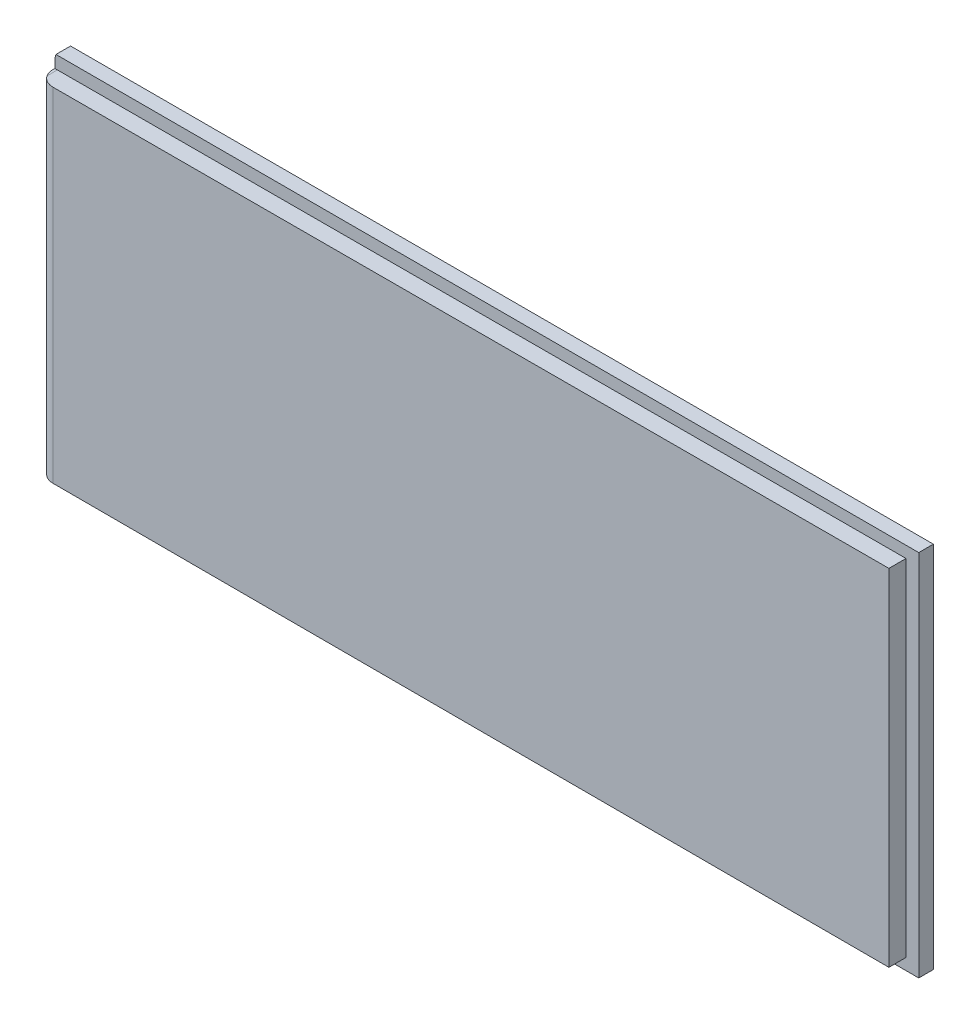
ISO-10303-21;
HEADER;
FILE_DESCRIPTION(('STEP AP214'),'2;1');
FILE_NAME('part.step','',(''),(''),'','','');
FILE_SCHEMA(('AUTOMOTIVE_DESIGN { 1 0 10303 214 1 1 1 1 }'));
ENDSEC;
DATA;
#1=APPLICATION_CONTEXT('core data for automotive mechanical design processes');
#2=APPLICATION_PROTOCOL_DEFINITION('international standard','automotive_design',2000,#1);
#3=PRODUCT_CONTEXT('',#1,'mechanical');
#4=PRODUCT('Part','Part','',(#3));
#5=PRODUCT_RELATED_PRODUCT_CATEGORY('part','',(#4));
#6=PRODUCT_DEFINITION_FORMATION('','',#4);
#7=PRODUCT_DEFINITION_CONTEXT('part definition',#1,'design');
#8=PRODUCT_DEFINITION('design','',#6,#7);
#9=PRODUCT_DEFINITION_SHAPE('','',#8);
#10=(LENGTH_UNIT() NAMED_UNIT(*) SI_UNIT(.MILLI.,.METRE.));
#11=(NAMED_UNIT(*) PLANE_ANGLE_UNIT() SI_UNIT($,.RADIAN.));
#12=(NAMED_UNIT(*) SI_UNIT($,.STERADIAN.) SOLID_ANGLE_UNIT());
#13=UNCERTAINTY_MEASURE_WITH_UNIT(LENGTH_MEASURE(1.E-05),#10,'distance_accuracy_value','');
#14=(GEOMETRIC_REPRESENTATION_CONTEXT(3) GLOBAL_UNCERTAINTY_ASSIGNED_CONTEXT((#13)) GLOBAL_UNIT_ASSIGNED_CONTEXT((#10,
#11,#12)) REPRESENTATION_CONTEXT('',''));
#15=CARTESIAN_POINT('',(0.,0.,0.));
#16=DIRECTION('',(0.,0.,1.));
#17=DIRECTION('',(1.,0.,0.));
#18=AXIS2_PLACEMENT_3D('',#15,#16,#17);
#19=CARTESIAN_POINT('',(-89.5000000000007,-14.,1.85342345181059));
#20=DIRECTION('',(0.,0.,1.));
#21=DIRECTION('',(1.,0.,0.));
#22=AXIS2_PLACEMENT_3D('',#19,#20,#21);
#23=PLANE('',#22);
#24=DIRECTION('',(0.999998918686875,0.00147058664512815,0.));
#25=VECTOR('',#24,1.);
#26=CARTESIAN_POINT('',(-24.0000000000007,13.5992641652252,1.8534234518106));
#27=LINE('',#26,#25);
#28=CARTESIAN_POINT('',(-89.8000000000006,13.5024994593429,1.8534234518106));
#29=VERTEX_POINT('',#28);
#30=CARTESIAN_POINT('',(-24.0000000000007,13.5992641652252,1.8534234518106));
#31=VERTEX_POINT('',#30);
#32=EDGE_CURVE('E136',#29,#31,#27,.T.);
#33=ORIENTED_EDGE('',*,*,#32,.F.);
#34=DIRECTION('',(0.,-1.,0.));
#35=VECTOR('',#34,1.);
#36=CARTESIAN_POINT('',(-89.8000000000007,-14.,1.85342345181059));
#37=LINE('',#36,#35);
#38=CARTESIAN_POINT('',(-89.8000000000007,-13.5024994593428,1.8534234518106));
#39=VERTEX_POINT('',#38);
#40=EDGE_CURVE('E252',#29,#39,#37,.T.);
#41=ORIENTED_EDGE('',*,*,#40,.T.);
#42=DIRECTION('',(-0.999998918686875,0.00147058664512737,0.));
#43=VECTOR('',#42,1.);
#44=CARTESIAN_POINT('',(-90.8000000000007,-13.5010288711075,1.8534234518106));
#45=LINE('',#44,#43);
#46=CARTESIAN_POINT('',(-24.0000000000007,-13.5992641652252,1.8534234518106));
#47=VERTEX_POINT('',#46);
#48=EDGE_CURVE('E161',#47,#39,#45,.T.);
#49=ORIENTED_EDGE('',*,*,#48,.F.);
#50=DIRECTION('',(0.,-1.,0.));
#51=VECTOR('',#50,1.);
#52=CARTESIAN_POINT('',(-24.0000000000007,-13.5992641652252,1.8534234518106));
#53=LINE('',#52,#51);
#54=EDGE_CURVE('E146',#31,#47,#53,.T.);
#55=ORIENTED_EDGE('',*,*,#54,.F.);
#56=EDGE_LOOP('',(#33,#41,#49,#55));
#57=FACE_BOUND('',#56,.T.);
#58=ADVANCED_FACE('F39',(#57),#23,.T.);
#59=CARTESIAN_POINT('',(-89.5000000000007,-14.,0.503423451810604));
#60=DIRECTION('',(0.,0.,1.));
#61=DIRECTION('',(1.,0.,0.));
#62=AXIS2_PLACEMENT_3D('',#59,#60,#61);
#63=PLANE('',#62);
#64=CARTESIAN_POINT('',(-89.5000000000007,14.,0.503423451810604));
#65=DIRECTION('',(0.,0.,1.));
#66=DIRECTION('',(1.,0.,0.));
#67=AXIS2_PLACEMENT_3D('',#64,#65,#66);
#68=CIRCLE('',#67,1.50000000000004);
#69=CARTESIAN_POINT('',(-90.9142135623738,14.5,0.503423451810604));
#70=VERTEX_POINT('',#69);
#71=CARTESIAN_POINT('',(-91.0000000000007,14.,0.503423451810604));
#72=VERTEX_POINT('',#71);
#73=EDGE_CURVE('E248',#70,#72,#68,.T.);
#74=ORIENTED_EDGE('',*,*,#73,.T.);
#75=DIRECTION('',(0.,-1.,0.));
#76=VECTOR('',#75,1.);
#77=CARTESIAN_POINT('',(-91.0000000000007,-14.,0.503423451810604));
#78=LINE('',#77,#76);
#79=CARTESIAN_POINT('',(-91.0000000000007,13.5010288711076,0.503423451810606));
#80=VERTEX_POINT('',#79);
#81=EDGE_CURVE('E231',#72,#80,#78,.T.);
#82=ORIENTED_EDGE('',*,*,#81,.T.);
#83=DIRECTION('',(-1.,0.,0.));
#84=VECTOR('',#83,1.);
#85=CARTESIAN_POINT('',(-90.8000000000007,13.5010288711076,0.503423451810606));
#86=LINE('',#85,#84);
#87=CARTESIAN_POINT('',(-90.8000000000007,13.5010288711076,0.503423451810606));
#88=VERTEX_POINT('',#87);
#89=EDGE_CURVE('E172',#88,#80,#86,.T.);
#90=ORIENTED_EDGE('',*,*,#89,.F.);
#91=DIRECTION('',(-0.999998918686875,-0.00147058664512815,0.));
#92=VECTOR('',#91,1.);
#93=CARTESIAN_POINT('',(-24.0000000000007,13.5992641652252,0.503423451810606));
#94=LINE('',#93,#92);
#95=CARTESIAN_POINT('',(-24.0000000000007,13.5992641652252,0.503423451810606));
#96=VERTEX_POINT('',#95);
#97=EDGE_CURVE('E270',#96,#88,#94,.T.);
#98=ORIENTED_EDGE('',*,*,#97,.F.);
#99=DIRECTION('',(0.,1.,0.));
#100=VECTOR('',#99,1.);
#101=CARTESIAN_POINT('',(-24.0000000000007,-13.5992641652252,0.503423451810606));
#102=LINE('',#101,#100);
#103=CARTESIAN_POINT('',(-24.0000000000007,-13.5992641652252,0.503423451810606));
#104=VERTEX_POINT('',#103);
#105=EDGE_CURVE('E154',#104,#96,#102,.T.);
#106=ORIENTED_EDGE('',*,*,#105,.F.);
#107=DIRECTION('',(0.999998918686875,-0.00147058664512737,0.));
#108=VECTOR('',#107,1.);
#109=CARTESIAN_POINT('',(-90.8000000000007,-13.5010288711075,0.503423451810606));
#110=LINE('',#109,#108);
#111=CARTESIAN_POINT('',(-90.8000000000007,-13.5010288711075,0.503423451810606));
#112=VERTEX_POINT('',#111);
#113=EDGE_CURVE('E266',#112,#104,#110,.T.);
#114=ORIENTED_EDGE('',*,*,#113,.F.);
#115=DIRECTION('',(1.,0.,0.));
#116=VECTOR('',#115,1.);
#117=CARTESIAN_POINT('',(-90.8000000000007,-13.5010288711075,0.503423451810606));
#118=LINE('',#117,#116);
#119=CARTESIAN_POINT('',(-91.0000000000007,-13.5010288711075,0.503423451810606));
#120=VERTEX_POINT('',#119);
#121=EDGE_CURVE('E188',#120,#112,#118,.T.);
#122=ORIENTED_EDGE('',*,*,#121,.F.);
#123=CARTESIAN_POINT('',(-91.0000000000007,-14.,0.503423451810604));
#124=VERTEX_POINT('',#123);
#125=EDGE_CURVE('E212',#120,#124,#78,.T.);
#126=ORIENTED_EDGE('',*,*,#125,.T.);
#127=CARTESIAN_POINT('',(-89.5000000000007,-14.,0.503423451810604));
#128=DIRECTION('',(0.,0.,1.));
#129=DIRECTION('',(1.,0.,0.));
#130=AXIS2_PLACEMENT_3D('',#127,#128,#129);
#131=CIRCLE('',#130,1.50000000000003);
#132=CARTESIAN_POINT('',(-90.9142135623738,-14.5,0.503423451810604));
#133=VERTEX_POINT('',#132);
#134=EDGE_CURVE('E244',#124,#133,#131,.T.);
#135=ORIENTED_EDGE('',*,*,#134,.T.);
#136=DIRECTION('',(1.,0.,0.));
#137=VECTOR('',#136,1.);
#138=CARTESIAN_POINT('',(-89.5000000000007,-14.5,0.503423451810604));
#139=LINE('',#138,#137);
#140=CARTESIAN_POINT('',(-23.0000000000007,-14.5,0.503423451810604));
#141=VERTEX_POINT('',#140);
#142=EDGE_CURVE('E240',#133,#141,#139,.T.);
#143=ORIENTED_EDGE('',*,*,#142,.T.);
#144=DIRECTION('',(0.,1.,0.));
#145=VECTOR('',#144,1.);
#146=CARTESIAN_POINT('',(-23.0000000000007,-14.,0.503423451810604));
#147=LINE('',#146,#145);
#148=CARTESIAN_POINT('',(-23.0000000000007,14.5,0.503423451810604));
#149=VERTEX_POINT('',#148);
#150=EDGE_CURVE('E236',#141,#149,#147,.T.);
#151=ORIENTED_EDGE('',*,*,#150,.T.);
#152=DIRECTION('',(-1.,0.,0.));
#153=VECTOR('',#152,1.);
#154=CARTESIAN_POINT('',(-89.5000000000007,14.5,0.503423451810604));
#155=LINE('',#154,#153);
#156=EDGE_CURVE('E232',#149,#70,#155,.T.);
#157=ORIENTED_EDGE('',*,*,#156,.T.);
#158=EDGE_LOOP('',(#74,#82,#90,#98,#106,#114,#122,#126,#135,#143,#151,#157));
#159=FACE_BOUND('',#158,.T.);
#160=ADVANCED_FACE('F286',(#159),#63,.T.);
#161=CARTESIAN_POINT('',(-89.5000000000007,14.,9.3534234518106));
#162=DIRECTION('',(0.,0.,-1.));
#163=DIRECTION('',(-1.,0.,0.));
#164=AXIS2_PLACEMENT_3D('',#161,#162,#163);
#165=CYLINDRICAL_SURFACE('',#164,1.50000000000004);
#166=DIRECTION('',(0.,0.,-1.));
#167=VECTOR('',#166,1.);
#168=CARTESIAN_POINT('',(-90.9142135623738,14.5,9.3534234518106));
#169=LINE('',#168,#167);
#170=CARTESIAN_POINT('',(-90.9142135623738,14.5,-0.646576548189396));
#171=VERTEX_POINT('',#170);
#172=EDGE_CURVE('E208',#70,#171,#169,.T.);
#173=ORIENTED_EDGE('',*,*,#172,.T.);
#174=CARTESIAN_POINT('',(-89.5000000000007,14.,-0.646576548189396));
#175=DIRECTION('',(0.,0.,-1.));
#176=DIRECTION('',(-1.,0.,0.));
#177=AXIS2_PLACEMENT_3D('',#174,#175,#176);
#178=CIRCLE('',#177,1.50000000000004);
#179=CARTESIAN_POINT('',(-91.0000000000007,14.,-0.646576548189396));
#180=VERTEX_POINT('',#179);
#181=EDGE_CURVE('E183',#180,#171,#178,.T.);
#182=ORIENTED_EDGE('',*,*,#181,.F.);
#183=DIRECTION('',(0.,0.,-1.));
#184=VECTOR('',#183,1.);
#185=CARTESIAN_POINT('',(-91.0000000000007,14.,9.3534234518106));
#186=LINE('',#185,#184);
#187=EDGE_CURVE('E209',#72,#180,#186,.T.);
#188=ORIENTED_EDGE('',*,*,#187,.F.);
#189=ORIENTED_EDGE('',*,*,#73,.F.);
#190=EDGE_LOOP('',(#173,#182,#188,#189));
#191=FACE_BOUND('',#190,.T.);
#192=ADVANCED_FACE('F284',(#191),#165,.T.);
#193=CARTESIAN_POINT('',(-91.0000000000007,-14.,9.3534234518106));
#194=DIRECTION('',(-1.,0.,0.));
#195=DIRECTION('',(0.,0.,1.));
#196=AXIS2_PLACEMENT_3D('',#193,#194,#195);
#197=PLANE('',#196);
#198=DIRECTION('',(0.,0.,1.));
#199=VECTOR('',#198,1.);
#200=CARTESIAN_POINT('',(-91.0000000000007,-13.5010288711075,-72.1433332485694));
#201=LINE('',#200,#199);
#202=CARTESIAN_POINT('',(-91.0000000000007,-13.5010288711075,0.653423451810589));
#203=VERTEX_POINT('',#202);
#204=EDGE_CURVE('E169',#120,#203,#201,.T.);
#205=ORIENTED_EDGE('',*,*,#204,.T.);
#206=DIRECTION('',(0.,-1.,0.));
#207=VECTOR('',#206,1.);
#208=CARTESIAN_POINT('',(-91.0000000000007,-14.,0.653423451810591));
#209=LINE('',#208,#207);
#210=CARTESIAN_POINT('',(-91.0000000000007,13.5010288711076,0.653423451810589));
#211=VERTEX_POINT('',#210);
#212=EDGE_CURVE('E62',#203,#211,#209,.F.);
#213=ORIENTED_EDGE('',*,*,#212,.T.);
#214=DIRECTION('',(0.,0.,1.));
#215=VECTOR('',#214,1.);
#216=CARTESIAN_POINT('',(-91.0000000000007,13.5010288711076,-72.1433332485694));
#217=LINE('',#216,#215);
#218=EDGE_CURVE('E165',#80,#211,#217,.T.);
#219=ORIENTED_EDGE('',*,*,#218,.F.);
#220=ORIENTED_EDGE('',*,*,#81,.F.);
#221=ORIENTED_EDGE('',*,*,#187,.T.);
#222=DIRECTION('',(0.,1.,0.));
#223=VECTOR('',#222,1.);
#224=CARTESIAN_POINT('',(-91.0000000000007,-14.,-0.646576548189396));
#225=LINE('',#224,#223);
#226=CARTESIAN_POINT('',(-91.0000000000007,-14.,-0.646576548189396));
#227=VERTEX_POINT('',#226);
#228=EDGE_CURVE('E204',#227,#180,#225,.T.);
#229=ORIENTED_EDGE('',*,*,#228,.F.);
#230=DIRECTION('',(0.,0.,-1.));
#231=VECTOR('',#230,1.);
#232=CARTESIAN_POINT('',(-91.0000000000007,-14.,9.3534234518106));
#233=LINE('',#232,#231);
#234=EDGE_CURVE('E213',#124,#227,#233,.T.);
#235=ORIENTED_EDGE('',*,*,#234,.F.);
#236=ORIENTED_EDGE('',*,*,#125,.F.);
#237=EDGE_LOOP('',(#205,#213,#219,#220,#221,#229,#235,#236));
#238=FACE_BOUND('',#237,.T.);
#239=ADVANCED_FACE('F279',(#238),#197,.T.);
#240=CARTESIAN_POINT('',(-89.5000000000007,-14.,9.3534234518106));
#241=DIRECTION('',(0.,0.,-1.));
#242=DIRECTION('',(-1.,0.,0.));
#243=AXIS2_PLACEMENT_3D('',#240,#241,#242);
#244=CYLINDRICAL_SURFACE('',#243,1.50000000000003);
#245=ORIENTED_EDGE('',*,*,#234,.T.);
#246=CARTESIAN_POINT('',(-89.5000000000007,-14.,-0.646576548189396));
#247=DIRECTION('',(0.,0.,-1.));
#248=DIRECTION('',(-1.,0.,0.));
#249=AXIS2_PLACEMENT_3D('',#246,#247,#248);
#250=CIRCLE('',#249,1.50000000000003);
#251=CARTESIAN_POINT('',(-90.9142135623738,-14.5,-0.646576548189396));
#252=VERTEX_POINT('',#251);
#253=EDGE_CURVE('E200',#252,#227,#250,.T.);
#254=ORIENTED_EDGE('',*,*,#253,.F.);
#255=DIRECTION('',(0.,0.,-1.));
#256=VECTOR('',#255,1.);
#257=CARTESIAN_POINT('',(-90.9142135623738,-14.5,9.3534234518106));
#258=LINE('',#257,#256);
#259=EDGE_CURVE('E216',#133,#252,#258,.T.);
#260=ORIENTED_EDGE('',*,*,#259,.F.);
#261=ORIENTED_EDGE('',*,*,#134,.F.);
#262=EDGE_LOOP('',(#245,#254,#260,#261));
#263=FACE_BOUND('',#262,.T.);
#264=ADVANCED_FACE('F342',(#263),#244,.T.);
#265=CARTESIAN_POINT('',(-23.0000000000007,-14.5,9.3534234518106));
#266=DIRECTION('',(0.,-1.,0.));
#267=DIRECTION('',(1.,0.,0.));
#268=AXIS2_PLACEMENT_3D('',#265,#266,#267);
#269=PLANE('',#268);
#270=ORIENTED_EDGE('',*,*,#259,.T.);
#271=DIRECTION('',(-1.,0.,0.));
#272=VECTOR('',#271,1.);
#273=CARTESIAN_POINT('',(-23.0000000000007,-14.5,-0.646576548189396));
#274=LINE('',#273,#272);
#275=CARTESIAN_POINT('',(-23.0000000000007,-14.5,-0.646576548189396));
#276=VERTEX_POINT('',#275);
#277=EDGE_CURVE('E196',#276,#252,#274,.T.);
#278=ORIENTED_EDGE('',*,*,#277,.F.);
#279=DIRECTION('',(0.,0.,-1.));
#280=VECTOR('',#279,1.);
#281=CARTESIAN_POINT('',(-23.0000000000007,-14.5,9.3534234518106));
#282=LINE('',#281,#280);
#283=EDGE_CURVE('E219',#141,#276,#282,.T.);
#284=ORIENTED_EDGE('',*,*,#283,.F.);
#285=ORIENTED_EDGE('',*,*,#142,.F.);
#286=EDGE_LOOP('',(#270,#278,#284,#285));
#287=FACE_BOUND('',#286,.T.);
#288=ADVANCED_FACE('F337',(#287),#269,.T.);
#289=CARTESIAN_POINT('',(-23.0000000000007,14.5,9.3534234518106));
#290=DIRECTION('',(1.,0.,0.));
#291=DIRECTION('',(0.,0.,-1.));
#292=AXIS2_PLACEMENT_3D('',#289,#290,#291);
#293=PLANE('',#292);
#294=ORIENTED_EDGE('',*,*,#283,.T.);
#295=DIRECTION('',(0.,-1.,0.));
#296=VECTOR('',#295,1.);
#297=CARTESIAN_POINT('',(-23.0000000000007,14.5,-0.646576548189396));
#298=LINE('',#297,#296);
#299=CARTESIAN_POINT('',(-23.0000000000007,14.5,-0.646576548189396));
#300=VERTEX_POINT('',#299);
#301=EDGE_CURVE('E192',#300,#276,#298,.T.);
#302=ORIENTED_EDGE('',*,*,#301,.F.);
#303=DIRECTION('',(0.,0.,-1.));
#304=VECTOR('',#303,1.);
#305=CARTESIAN_POINT('',(-23.0000000000007,14.5,9.3534234518106));
#306=LINE('',#305,#304);
#307=EDGE_CURVE('E222',#149,#300,#306,.T.);
#308=ORIENTED_EDGE('',*,*,#307,.F.);
#309=ORIENTED_EDGE('',*,*,#150,.F.);
#310=EDGE_LOOP('',(#294,#302,#308,#309));
#311=FACE_BOUND('',#310,.T.);
#312=ADVANCED_FACE('F292',(#311),#293,.T.);
#313=CARTESIAN_POINT('',(-90.9142135623738,14.5,9.3534234518106));
#314=DIRECTION('',(0.,1.,0.));
#315=DIRECTION('',(0.,0.,1.));
#316=AXIS2_PLACEMENT_3D('',#313,#314,#315);
#317=PLANE('',#316);
#318=ORIENTED_EDGE('',*,*,#307,.T.);
#319=DIRECTION('',(1.,0.,0.));
#320=VECTOR('',#319,1.);
#321=CARTESIAN_POINT('',(-90.9142135623738,14.5,-0.646576548189396));
#322=LINE('',#321,#320);
#323=EDGE_CURVE('E187',#171,#300,#322,.T.);
#324=ORIENTED_EDGE('',*,*,#323,.F.);
#325=ORIENTED_EDGE('',*,*,#172,.F.);
#326=ORIENTED_EDGE('',*,*,#156,.F.);
#327=EDGE_LOOP('',(#318,#324,#325,#326));
#328=FACE_BOUND('',#327,.T.);
#329=ADVANCED_FACE('F289',(#328),#317,.T.);
#330=CARTESIAN_POINT('',(-89.5000000000007,-14.,-0.646576548189396));
#331=DIRECTION('',(0.,0.,1.));
#332=DIRECTION('',(1.,0.,0.));
#333=AXIS2_PLACEMENT_3D('',#330,#331,#332);
#334=PLANE('',#333);
#335=ORIENTED_EDGE('',*,*,#181,.T.);
#336=ORIENTED_EDGE('',*,*,#323,.T.);
#337=ORIENTED_EDGE('',*,*,#301,.T.);
#338=ORIENTED_EDGE('',*,*,#277,.T.);
#339=ORIENTED_EDGE('',*,*,#253,.T.);
#340=ORIENTED_EDGE('',*,*,#228,.T.);
#341=EDGE_LOOP('',(#335,#336,#337,#338,#339,#340));
#342=FACE_BOUND('',#341,.T.);
#343=ADVANCED_FACE('F296',(#342),#334,.F.);
#344=CARTESIAN_POINT('',(-90.8000000000007,-13.5010288711075,-72.1433332485694));
#345=DIRECTION('',(0.,1.,0.));
#346=DIRECTION('',(0.,0.,1.));
#347=AXIS2_PLACEMENT_3D('',#344,#345,#346);
#348=PLANE('',#347);
#349=DIRECTION('',(0.,0.,1.));
#350=VECTOR('',#349,1.);
#351=CARTESIAN_POINT('',(-90.8000000000007,-13.5010288711075,-72.1433332485694));
#352=LINE('',#351,#350);
#353=CARTESIAN_POINT('',(-90.8000000000007,-13.5010288711075,1.31674840988166));
#354=VERTEX_POINT('',#353);
#355=EDGE_CURVE('E173',#112,#354,#352,.T.);
#356=ORIENTED_EDGE('',*,*,#355,.T.);
#357=CARTESIAN_POINT('',(-89.8000000000007,-13.5010288711075,0.653423451810592));
#358=DIRECTION('',(0.,1.,0.));
#359=DIRECTION('',(0.,0.,1.));
#360=AXIS2_PLACEMENT_3D('',#357,#358,#359);
#361=CIRCLE('',#360,1.2);
#362=EDGE_CURVE('E258',#354,#203,#361,.F.);
#363=ORIENTED_EDGE('',*,*,#362,.T.);
#364=ORIENTED_EDGE('',*,*,#204,.F.);
#365=ORIENTED_EDGE('',*,*,#121,.T.);
#366=EDGE_LOOP('',(#356,#363,#364,#365));
#367=FACE_BOUND('',#366,.T.);
#368=ADVANCED_FACE('F305',(#367),#348,.F.);
#369=CARTESIAN_POINT('',(-90.8000000000007,-13.5010288711075,-72.1433332485694));
#370=DIRECTION('',(0.00147058664512737,0.999998918686875,0.));
#371=DIRECTION('',(-0.999998918686875,0.00147058664512737,0.));
#372=AXIS2_PLACEMENT_3D('',#369,#370,#371);
#373=PLANE('',#372);
#374=ORIENTED_EDGE('',*,*,#48,.T.);
#375=CARTESIAN_POINT('',(-89.8000000000007,-13.5024994593428,0.653423451810592));
#376=DIRECTION('',(0.00147058664512737,0.999998918686875,0.));
#377=DIRECTION('',(0.999998918686875,-0.00147058664512737,0.));
#378=AXIS2_PLACEMENT_3D('',#375,#376,#377);
#379=ELLIPSE('',#378,1.20000129757715,1.2);
#380=EDGE_CURVE('E255',#39,#354,#379,.F.);
#381=ORIENTED_EDGE('',*,*,#380,.T.);
#382=ORIENTED_EDGE('',*,*,#355,.F.);
#383=ORIENTED_EDGE('',*,*,#113,.T.);
#384=DIRECTION('',(0.,0.,1.));
#385=VECTOR('',#384,1.);
#386=CARTESIAN_POINT('',(-24.0000000000007,-13.5992641652252,-72.1433332485694));
#387=LINE('',#386,#385);
#388=EDGE_CURVE('E157',#104,#47,#387,.T.);
#389=ORIENTED_EDGE('',*,*,#388,.T.);
#390=EDGE_LOOP('',(#374,#381,#382,#383,#389));
#391=FACE_BOUND('',#390,.T.);
#392=ADVANCED_FACE('F309',(#391),#373,.F.);
#393=CARTESIAN_POINT('',(-24.0000000000007,-13.5992641652252,-72.1433332485694));
#394=DIRECTION('',(-1.,0.,0.));
#395=DIRECTION('',(0.,-1.,0.));
#396=AXIS2_PLACEMENT_3D('',#393,#394,#395);
#397=PLANE('',#396);
#398=ORIENTED_EDGE('',*,*,#105,.T.);
#399=DIRECTION('',(0.,0.,1.));
#400=VECTOR('',#399,1.);
#401=CARTESIAN_POINT('',(-24.0000000000007,13.5992641652252,-72.1433332485694));
#402=LINE('',#401,#400);
#403=EDGE_CURVE('E139',#96,#31,#402,.T.);
#404=ORIENTED_EDGE('',*,*,#403,.T.);
#405=ORIENTED_EDGE('',*,*,#54,.T.);
#406=ORIENTED_EDGE('',*,*,#388,.F.);
#407=EDGE_LOOP('',(#398,#404,#405,#406));
#408=FACE_BOUND('',#407,.T.);
#409=ADVANCED_FACE('F150',(#408),#397,.F.);
#410=CARTESIAN_POINT('',(-24.0000000000007,13.5992641652252,-72.1433332485694));
#411=DIRECTION('',(0.00147058664512815,-0.999998918686875,0.));
#412=DIRECTION('',(0.999998918686875,0.00147058664512815,0.));
#413=AXIS2_PLACEMENT_3D('',#410,#411,#412);
#414=PLANE('',#413);
#415=DIRECTION('',(0.,0.,1.));
#416=VECTOR('',#415,1.);
#417=CARTESIAN_POINT('',(-90.8000000000007,13.5010288711076,-72.1433332485694));
#418=LINE('',#417,#416);
#419=CARTESIAN_POINT('',(-90.8000000000007,13.5010288711076,1.31674840988166));
#420=VERTEX_POINT('',#419);
#421=EDGE_CURVE('E158',#88,#420,#418,.T.);
#422=ORIENTED_EDGE('',*,*,#421,.T.);
#423=CARTESIAN_POINT('',(-89.8000000000007,13.5024994593429,0.653423451810592));
#424=DIRECTION('',(0.00147058664512815,-0.999998918686875,0.));
#425=DIRECTION('',(-0.999998918686875,-0.00147058664512815,0.));
#426=AXIS2_PLACEMENT_3D('',#423,#424,#425);
#427=ELLIPSE('',#426,1.20000129757715,1.2);
#428=EDGE_CURVE('E11',#420,#29,#427,.F.);
#429=ORIENTED_EDGE('',*,*,#428,.T.);
#430=ORIENTED_EDGE('',*,*,#32,.T.);
#431=ORIENTED_EDGE('',*,*,#403,.F.);
#432=ORIENTED_EDGE('',*,*,#97,.T.);
#433=EDGE_LOOP('',(#422,#429,#430,#431,#432));
#434=FACE_BOUND('',#433,.T.);
#435=ADVANCED_FACE('F138',(#434),#414,.F.);
#436=CARTESIAN_POINT('',(-90.8000000000007,13.5010288711076,-72.1433332485694));
#437=DIRECTION('',(0.,-1.,0.));
#438=DIRECTION('',(0.,0.,-1.));
#439=AXIS2_PLACEMENT_3D('',#436,#437,#438);
#440=PLANE('',#439);
#441=ORIENTED_EDGE('',*,*,#218,.T.);
#442=CARTESIAN_POINT('',(-89.8000000000007,13.5010288711076,0.653423451810592));
#443=DIRECTION('',(0.,-1.,0.));
#444=DIRECTION('',(0.,0.,-1.));
#445=AXIS2_PLACEMENT_3D('',#442,#443,#444);
#446=CIRCLE('',#445,1.2);
#447=EDGE_CURVE('E48',#211,#420,#446,.F.);
#448=ORIENTED_EDGE('',*,*,#447,.T.);
#449=ORIENTED_EDGE('',*,*,#421,.F.);
#450=ORIENTED_EDGE('',*,*,#89,.T.);
#451=EDGE_LOOP('',(#441,#448,#449,#450));
#452=FACE_BOUND('',#451,.T.);
#453=ADVANCED_FACE('F277',(#452),#440,.F.);
#454=CARTESIAN_POINT('',(-89.8000000000007,-14.,0.653423451810592));
#455=DIRECTION('',(0.,-1.,0.));
#456=DIRECTION('',(0.,0.,-1.));
#457=AXIS2_PLACEMENT_3D('',#454,#455,#456);
#458=CYLINDRICAL_SURFACE('',#457,1.2);
#459=ORIENTED_EDGE('',*,*,#447,.F.);
#460=ORIENTED_EDGE('',*,*,#212,.F.);
#461=ORIENTED_EDGE('',*,*,#362,.F.);
#462=ORIENTED_EDGE('',*,*,#380,.F.);
#463=ORIENTED_EDGE('',*,*,#40,.F.);
#464=ORIENTED_EDGE('',*,*,#428,.F.);
#465=EDGE_LOOP('',(#459,#460,#461,#462,#463,#464));
#466=FACE_BOUND('',#465,.T.);
#467=ADVANCED_FACE('F41',(#466),#458,.T.);
#468=CLOSED_SHELL('',(#58,#160,#192,#239,#264,#288,#312,#329,#343,#368,#392,#409,#435,#453,#467));
#469=MANIFOLD_SOLID_BREP('B2',#468);
#470=ADVANCED_BREP_SHAPE_REPRESENTATION('',(#18,#469),#14);
#471=SHAPE_DEFINITION_REPRESENTATION(#9,#470);
ENDSEC;
END-ISO-10303-21;
